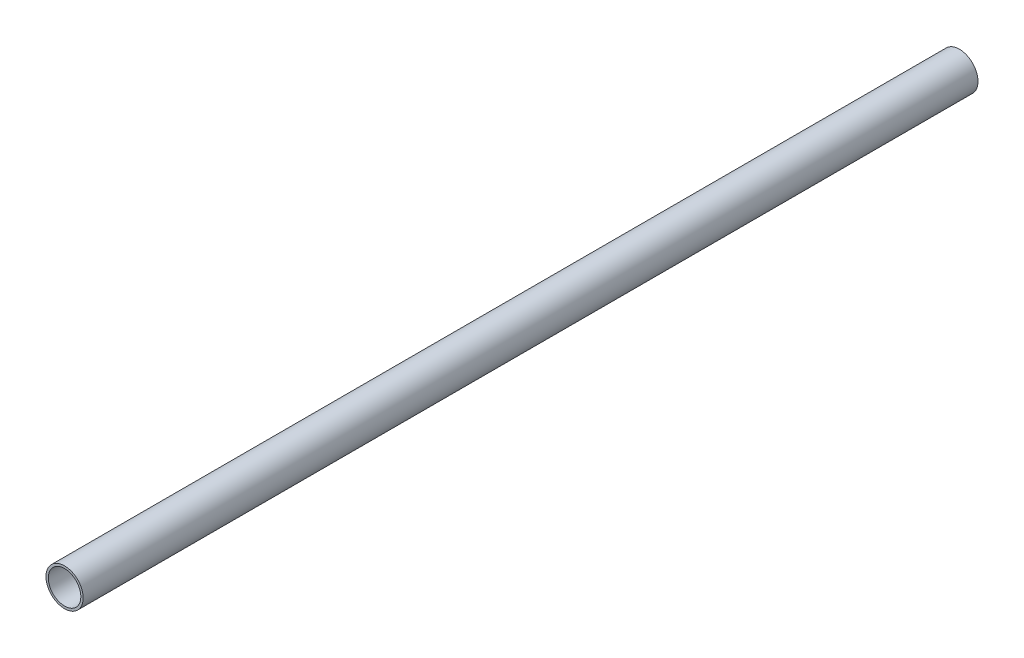
ISO-10303-21;
HEADER;
FILE_DESCRIPTION(('STEP AP214'),'2;1');
FILE_NAME('part.step','',(''),(''),'','','');
FILE_SCHEMA(('AUTOMOTIVE_DESIGN { 1 0 10303 214 1 1 1 1 }'));
ENDSEC;
DATA;
#1=APPLICATION_CONTEXT('core data for automotive mechanical design processes');
#2=APPLICATION_PROTOCOL_DEFINITION('international standard','automotive_design',2000,#1);
#3=PRODUCT_CONTEXT('',#1,'mechanical');
#4=PRODUCT('Part','Part','',(#3));
#5=PRODUCT_RELATED_PRODUCT_CATEGORY('part','',(#4));
#6=PRODUCT_DEFINITION_FORMATION('','',#4);
#7=PRODUCT_DEFINITION_CONTEXT('part definition',#1,'design');
#8=PRODUCT_DEFINITION('design','',#6,#7);
#9=PRODUCT_DEFINITION_SHAPE('','',#8);
#10=(LENGTH_UNIT() NAMED_UNIT(*) SI_UNIT(.MILLI.,.METRE.));
#11=(NAMED_UNIT(*) PLANE_ANGLE_UNIT() SI_UNIT($,.RADIAN.));
#12=(NAMED_UNIT(*) SI_UNIT($,.STERADIAN.) SOLID_ANGLE_UNIT());
#13=UNCERTAINTY_MEASURE_WITH_UNIT(LENGTH_MEASURE(1.E-05),#10,'distance_accuracy_value','');
#14=(GEOMETRIC_REPRESENTATION_CONTEXT(3) GLOBAL_UNCERTAINTY_ASSIGNED_CONTEXT((#13)) GLOBAL_UNIT_ASSIGNED_CONTEXT((#10,
#11,#12)) REPRESENTATION_CONTEXT('',''));
#15=CARTESIAN_POINT('',(0.,0.,0.));
#16=DIRECTION('',(0.,0.,1.));
#17=DIRECTION('',(1.,0.,0.));
#18=AXIS2_PLACEMENT_3D('',#15,#16,#17);
#19=CARTESIAN_POINT('',(0.,0.,192.5));
#20=DIRECTION('',(0.,0.,1.));
#21=DIRECTION('',(1.,0.,0.));
#22=AXIS2_PLACEMENT_3D('',#19,#20,#21);
#23=PLANE('',#22);
#24=CARTESIAN_POINT('',(0.,0.,192.5));
#25=DIRECTION('',(0.,0.,1.));
#26=DIRECTION('',(1.,0.,0.));
#27=AXIS2_PLACEMENT_3D('',#24,#25,#26);
#28=CIRCLE('',#27,8.);
#29=CARTESIAN_POINT('',(8.,0.,192.5));
#30=VERTEX_POINT('',#29);
#31=EDGE_CURVE('E10',#30,#30,#28,.T.);
#32=ORIENTED_EDGE('',*,*,#31,.T.);
#33=EDGE_LOOP('',(#32));
#34=FACE_BOUND('',#33,.T.);
#35=CARTESIAN_POINT('',(0.,0.,192.5));
#36=DIRECTION('',(0.,0.,1.));
#37=DIRECTION('',(1.,0.,0.));
#38=AXIS2_PLACEMENT_3D('',#35,#36,#37);
#39=CIRCLE('',#38,7.);
#40=CARTESIAN_POINT('',(7.,0.,192.5));
#41=VERTEX_POINT('',#40);
#42=EDGE_CURVE('E44',#41,#41,#39,.T.);
#43=ORIENTED_EDGE('',*,*,#42,.F.);
#44=EDGE_LOOP('',(#43));
#45=FACE_BOUND('',#44,.T.);
#46=ADVANCED_FACE('F33',(#34,#45),#23,.T.);
#47=CARTESIAN_POINT('',(0.,0.,-192.5));
#48=DIRECTION('',(0.,0.,1.));
#49=DIRECTION('',(1.,0.,0.));
#50=AXIS2_PLACEMENT_3D('',#47,#48,#49);
#51=PLANE('',#50);
#52=CARTESIAN_POINT('',(0.,0.,-192.5));
#53=DIRECTION('',(0.,0.,1.));
#54=DIRECTION('',(1.,0.,0.));
#55=AXIS2_PLACEMENT_3D('',#52,#53,#54);
#56=CIRCLE('',#55,8.);
#57=CARTESIAN_POINT('',(8.,0.,-192.5));
#58=VERTEX_POINT('',#57);
#59=EDGE_CURVE('E37',#58,#58,#56,.T.);
#60=ORIENTED_EDGE('',*,*,#59,.F.);
#61=EDGE_LOOP('',(#60));
#62=FACE_BOUND('',#61,.T.);
#63=CARTESIAN_POINT('',(0.,0.,-192.5));
#64=DIRECTION('',(0.,0.,1.));
#65=DIRECTION('',(1.,0.,0.));
#66=AXIS2_PLACEMENT_3D('',#63,#64,#65);
#67=CIRCLE('',#66,7.);
#68=CARTESIAN_POINT('',(7.,0.,-192.5));
#69=VERTEX_POINT('',#68);
#70=EDGE_CURVE('E46',#69,#69,#67,.T.);
#71=ORIENTED_EDGE('',*,*,#70,.T.);
#72=EDGE_LOOP('',(#71));
#73=FACE_BOUND('',#72,.T.);
#74=ADVANCED_FACE('F56',(#62,#73),#51,.F.);
#75=CARTESIAN_POINT('',(0.,0.,192.5));
#76=DIRECTION('',(0.,0.,-1.));
#77=DIRECTION('',(-1.,0.,0.));
#78=AXIS2_PLACEMENT_3D('',#75,#76,#77);
#79=CYLINDRICAL_SURFACE('',#78,8.);
#80=ORIENTED_EDGE('',*,*,#31,.F.);
#81=EDGE_LOOP('',(#80));
#82=FACE_BOUND('',#81,.T.);
#83=ORIENTED_EDGE('',*,*,#59,.T.);
#84=EDGE_LOOP('',(#83));
#85=FACE_BOUND('',#84,.T.);
#86=ADVANCED_FACE('F35',(#82,#85),#79,.T.);
#87=CARTESIAN_POINT('',(0.,0.,192.5));
#88=DIRECTION('',(0.,0.,-1.));
#89=DIRECTION('',(-1.,0.,0.));
#90=AXIS2_PLACEMENT_3D('',#87,#88,#89);
#91=CYLINDRICAL_SURFACE('',#90,7.);
#92=ORIENTED_EDGE('',*,*,#42,.T.);
#93=EDGE_LOOP('',(#92));
#94=FACE_BOUND('',#93,.T.);
#95=ORIENTED_EDGE('',*,*,#70,.F.);
#96=EDGE_LOOP('',(#95));
#97=FACE_BOUND('',#96,.T.);
#98=ADVANCED_FACE('F52',(#94,#97),#91,.F.);
#99=CLOSED_SHELL('',(#46,#74,#86,#98));
#100=MANIFOLD_SOLID_BREP('B2',#99);
#101=ADVANCED_BREP_SHAPE_REPRESENTATION('',(#18,#100),#14);
#102=SHAPE_DEFINITION_REPRESENTATION(#9,#101);
ENDSEC;
END-ISO-10303-21;
